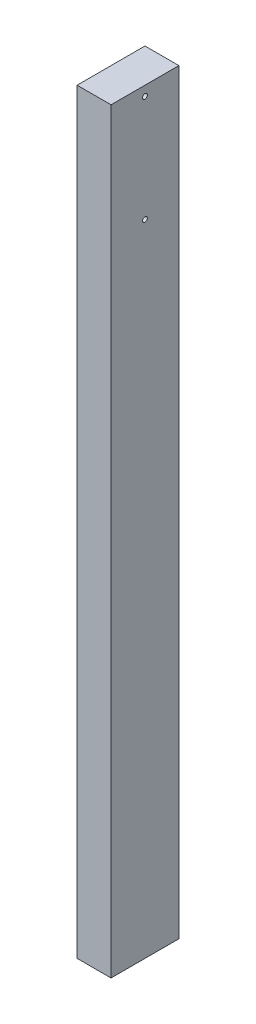
ISO-10303-21;
HEADER;
FILE_DESCRIPTION(('STEP AP214'),'2;1');
FILE_NAME('part.step','',(''),(''),'','','');
FILE_SCHEMA(('AUTOMOTIVE_DESIGN { 1 0 10303 214 1 1 1 1 }'));
ENDSEC;
DATA;
#1=APPLICATION_CONTEXT('core data for automotive mechanical design processes');
#2=APPLICATION_PROTOCOL_DEFINITION('international standard','automotive_design',2000,#1);
#3=PRODUCT_CONTEXT('',#1,'mechanical');
#4=PRODUCT('Part','Part','',(#3));
#5=PRODUCT_RELATED_PRODUCT_CATEGORY('part','',(#4));
#6=PRODUCT_DEFINITION_FORMATION('','',#4);
#7=PRODUCT_DEFINITION_CONTEXT('part definition',#1,'design');
#8=PRODUCT_DEFINITION('design','',#6,#7);
#9=PRODUCT_DEFINITION_SHAPE('','',#8);
#10=(LENGTH_UNIT() NAMED_UNIT(*) SI_UNIT(.MILLI.,.METRE.));
#11=(NAMED_UNIT(*) PLANE_ANGLE_UNIT() SI_UNIT($,.RADIAN.));
#12=(NAMED_UNIT(*) SI_UNIT($,.STERADIAN.) SOLID_ANGLE_UNIT());
#13=UNCERTAINTY_MEASURE_WITH_UNIT(LENGTH_MEASURE(1.E-05),#10,'distance_accuracy_value','');
#14=(GEOMETRIC_REPRESENTATION_CONTEXT(3) GLOBAL_UNCERTAINTY_ASSIGNED_CONTEXT((#13)) GLOBAL_UNIT_ASSIGNED_CONTEXT((#10,
#11,#12)) REPRESENTATION_CONTEXT('',''));
#15=CARTESIAN_POINT('',(0.,0.,0.));
#16=DIRECTION('',(0.,0.,1.));
#17=DIRECTION('',(1.,0.,0.));
#18=AXIS2_PLACEMENT_3D('',#15,#16,#17);
#19=CARTESIAN_POINT('',(-22.225,990.6,-44.45));
#20=DIRECTION('',(1.,0.,0.));
#21=DIRECTION('',(0.,0.,-1.));
#22=AXIS2_PLACEMENT_3D('',#19,#20,#21);
#23=PLANE('',#22);
#24=CARTESIAN_POINT('',(-22.225,838.2,0.));
#25=DIRECTION('',(-1.,0.,0.));
#26=DIRECTION('',(0.,0.,1.));
#27=AXIS2_PLACEMENT_3D('',#24,#25,#26);
#28=CIRCLE('',#27,3.175);
#29=CARTESIAN_POINT('',(-22.225,838.2,3.17500000000001));
#30=VERTEX_POINT('',#29);
#31=EDGE_CURVE('E118',#30,#30,#28,.T.);
#32=ORIENTED_EDGE('',*,*,#31,.F.);
#33=EDGE_LOOP('',(#32));
#34=FACE_BOUND('',#33,.T.);
#35=CARTESIAN_POINT('',(-22.225,977.9,0.));
#36=DIRECTION('',(-1.,0.,0.));
#37=DIRECTION('',(0.,0.,1.));
#38=AXIS2_PLACEMENT_3D('',#35,#36,#37);
#39=CIRCLE('',#38,3.175);
#40=CARTESIAN_POINT('',(-22.225,977.9,3.17500000000001));
#41=VERTEX_POINT('',#40);
#42=EDGE_CURVE('E110',#41,#41,#39,.T.);
#43=ORIENTED_EDGE('',*,*,#42,.F.);
#44=EDGE_LOOP('',(#43));
#45=FACE_BOUND('',#44,.T.);
#46=DIRECTION('',(0.,0.,1.));
#47=VECTOR('',#46,1.);
#48=CARTESIAN_POINT('',(-22.225,0.,-44.45));
#49=LINE('',#48,#47);
#50=CARTESIAN_POINT('',(-22.225,0.,-44.45));
#51=VERTEX_POINT('',#50);
#52=CARTESIAN_POINT('',(-22.225,0.,44.45));
#53=VERTEX_POINT('',#52);
#54=EDGE_CURVE('E101',#51,#53,#49,.T.);
#55=ORIENTED_EDGE('',*,*,#54,.T.);
#56=DIRECTION('',(0.,-1.,0.));
#57=VECTOR('',#56,1.);
#58=CARTESIAN_POINT('',(-22.225,990.6,44.45));
#59=LINE('',#58,#57);
#60=CARTESIAN_POINT('',(-22.225,990.6,44.45));
#61=VERTEX_POINT('',#60);
#62=EDGE_CURVE('E11',#61,#53,#59,.T.);
#63=ORIENTED_EDGE('',*,*,#62,.F.);
#64=DIRECTION('',(0.,0.,1.));
#65=VECTOR('',#64,1.);
#66=CARTESIAN_POINT('',(-22.225,990.6,-44.45));
#67=LINE('',#66,#65);
#68=CARTESIAN_POINT('',(-22.225,990.6,-44.45));
#69=VERTEX_POINT('',#68);
#70=EDGE_CURVE('E88',#69,#61,#67,.T.);
#71=ORIENTED_EDGE('',*,*,#70,.F.);
#72=DIRECTION('',(0.,-1.,0.));
#73=VECTOR('',#72,1.);
#74=CARTESIAN_POINT('',(-22.225,990.6,-44.45));
#75=LINE('',#74,#73);
#76=EDGE_CURVE('E97',#69,#51,#75,.T.);
#77=ORIENTED_EDGE('',*,*,#76,.T.);
#78=EDGE_LOOP('',(#55,#63,#71,#77));
#79=FACE_BOUND('',#78,.T.);
#80=ADVANCED_FACE('F35',(#34,#45,#79),#23,.F.);
#81=CARTESIAN_POINT('',(22.225,990.6,44.45));
#82=DIRECTION('',(0.,0.,-1.));
#83=DIRECTION('',(-1.,0.,0.));
#84=AXIS2_PLACEMENT_3D('',#81,#82,#83);
#85=PLANE('',#84);
#86=DIRECTION('',(1.,0.,0.));
#87=VECTOR('',#86,1.);
#88=CARTESIAN_POINT('',(22.225,0.,44.45));
#89=LINE('',#88,#87);
#90=CARTESIAN_POINT('',(22.225,0.,44.45));
#91=VERTEX_POINT('',#90);
#92=EDGE_CURVE('E92',#53,#91,#89,.T.);
#93=ORIENTED_EDGE('',*,*,#92,.T.);
#94=DIRECTION('',(0.,-1.,0.));
#95=VECTOR('',#94,1.);
#96=CARTESIAN_POINT('',(22.225,990.6,44.45));
#97=LINE('',#96,#95);
#98=CARTESIAN_POINT('',(22.225,990.6,44.45));
#99=VERTEX_POINT('',#98);
#100=EDGE_CURVE('E44',#99,#91,#97,.T.);
#101=ORIENTED_EDGE('',*,*,#100,.F.);
#102=DIRECTION('',(1.,0.,0.));
#103=VECTOR('',#102,1.);
#104=CARTESIAN_POINT('',(22.225,990.6,44.45));
#105=LINE('',#104,#103);
#106=EDGE_CURVE('E83',#61,#99,#105,.T.);
#107=ORIENTED_EDGE('',*,*,#106,.F.);
#108=ORIENTED_EDGE('',*,*,#62,.T.);
#109=EDGE_LOOP('',(#93,#101,#107,#108));
#110=FACE_BOUND('',#109,.T.);
#111=ADVANCED_FACE('F91',(#110),#85,.F.);
#112=CARTESIAN_POINT('',(22.225,990.6,-44.45));
#113=DIRECTION('',(-1.,0.,0.));
#114=DIRECTION('',(0.,0.,1.));
#115=AXIS2_PLACEMENT_3D('',#112,#113,#114);
#116=PLANE('',#115);
#117=CARTESIAN_POINT('',(22.2250000000001,838.2,0.));
#118=DIRECTION('',(-1.,0.,0.));
#119=DIRECTION('',(0.,0.,1.));
#120=AXIS2_PLACEMENT_3D('',#117,#118,#119);
#121=CIRCLE('',#120,3.175);
#122=CARTESIAN_POINT('',(22.2250000000001,838.2,3.175));
#123=VERTEX_POINT('',#122);
#124=EDGE_CURVE('E38',#123,#123,#121,.T.);
#125=ORIENTED_EDGE('',*,*,#124,.T.);
#126=EDGE_LOOP('',(#125));
#127=FACE_BOUND('',#126,.T.);
#128=CARTESIAN_POINT('',(22.2250000000001,977.9,0.));
#129=DIRECTION('',(-1.,0.,0.));
#130=DIRECTION('',(0.,0.,1.));
#131=AXIS2_PLACEMENT_3D('',#128,#129,#130);
#132=CIRCLE('',#131,3.175);
#133=CARTESIAN_POINT('',(22.2250000000001,977.9,3.175));
#134=VERTEX_POINT('',#133);
#135=EDGE_CURVE('E104',#134,#134,#132,.T.);
#136=ORIENTED_EDGE('',*,*,#135,.T.);
#137=EDGE_LOOP('',(#136));
#138=FACE_BOUND('',#137,.T.);
#139=DIRECTION('',(0.,0.,-1.));
#140=VECTOR('',#139,1.);
#141=CARTESIAN_POINT('',(22.225,0.,-44.45));
#142=LINE('',#141,#140);
#143=CARTESIAN_POINT('',(22.225,0.,-44.45));
#144=VERTEX_POINT('',#143);
#145=EDGE_CURVE('E70',#91,#144,#142,.T.);
#146=ORIENTED_EDGE('',*,*,#145,.T.);
#147=DIRECTION('',(0.,-1.,0.));
#148=VECTOR('',#147,1.);
#149=CARTESIAN_POINT('',(22.225,990.6,-44.45));
#150=LINE('',#149,#148);
#151=CARTESIAN_POINT('',(22.225,990.6,-44.45));
#152=VERTEX_POINT('',#151);
#153=EDGE_CURVE('E93',#152,#144,#150,.T.);
#154=ORIENTED_EDGE('',*,*,#153,.F.);
#155=DIRECTION('',(0.,0.,-1.));
#156=VECTOR('',#155,1.);
#157=CARTESIAN_POINT('',(22.225,990.6,-44.45));
#158=LINE('',#157,#156);
#159=EDGE_CURVE('E86',#99,#152,#158,.T.);
#160=ORIENTED_EDGE('',*,*,#159,.F.);
#161=ORIENTED_EDGE('',*,*,#100,.T.);
#162=EDGE_LOOP('',(#146,#154,#160,#161));
#163=FACE_BOUND('',#162,.T.);
#164=ADVANCED_FACE('F95',(#127,#138,#163),#116,.F.);
#165=CARTESIAN_POINT('',(22.225,990.6,-44.45));
#166=DIRECTION('',(0.,0.,1.));
#167=DIRECTION('',(1.,0.,0.));
#168=AXIS2_PLACEMENT_3D('',#165,#166,#167);
#169=PLANE('',#168);
#170=DIRECTION('',(-1.,0.,0.));
#171=VECTOR('',#170,1.);
#172=CARTESIAN_POINT('',(22.225,0.,-44.45));
#173=LINE('',#172,#171);
#174=EDGE_CURVE('E76',#144,#51,#173,.T.);
#175=ORIENTED_EDGE('',*,*,#174,.T.);
#176=ORIENTED_EDGE('',*,*,#76,.F.);
#177=DIRECTION('',(-1.,0.,0.));
#178=VECTOR('',#177,1.);
#179=CARTESIAN_POINT('',(22.225,990.6,-44.45));
#180=LINE('',#179,#178);
#181=EDGE_CURVE('E53',#152,#69,#180,.T.);
#182=ORIENTED_EDGE('',*,*,#181,.F.);
#183=ORIENTED_EDGE('',*,*,#153,.T.);
#184=EDGE_LOOP('',(#175,#176,#182,#183));
#185=FACE_BOUND('',#184,.T.);
#186=ADVANCED_FACE('F140',(#185),#169,.F.);
#187=CARTESIAN_POINT('',(0.,990.6,0.));
#188=DIRECTION('',(0.,-1.,0.));
#189=DIRECTION('',(0.,0.,-1.));
#190=AXIS2_PLACEMENT_3D('',#187,#188,#189);
#191=PLANE('',#190);
#192=ORIENTED_EDGE('',*,*,#70,.T.);
#193=ORIENTED_EDGE('',*,*,#106,.T.);
#194=ORIENTED_EDGE('',*,*,#159,.T.);
#195=ORIENTED_EDGE('',*,*,#181,.T.);
#196=EDGE_LOOP('',(#192,#193,#194,#195));
#197=FACE_BOUND('',#196,.T.);
#198=ADVANCED_FACE('F84',(#197),#191,.F.);
#199=CARTESIAN_POINT('',(0.,0.,0.));
#200=DIRECTION('',(0.,-1.,0.));
#201=DIRECTION('',(0.,0.,-1.));
#202=AXIS2_PLACEMENT_3D('',#199,#200,#201);
#203=PLANE('',#202);
#204=ORIENTED_EDGE('',*,*,#54,.F.);
#205=ORIENTED_EDGE('',*,*,#174,.F.);
#206=ORIENTED_EDGE('',*,*,#145,.F.);
#207=ORIENTED_EDGE('',*,*,#92,.F.);
#208=EDGE_LOOP('',(#204,#205,#206,#207));
#209=FACE_BOUND('',#208,.T.);
#210=ADVANCED_FACE('F131',(#209),#203,.T.);
#211=CARTESIAN_POINT('',(955.675,977.9,0.));
#212=DIRECTION('',(-1.,0.,0.));
#213=DIRECTION('',(0.,0.,1.));
#214=AXIS2_PLACEMENT_3D('',#211,#212,#213);
#215=CYLINDRICAL_SURFACE('',#214,3.175);
#216=ORIENTED_EDGE('',*,*,#42,.T.);
#217=EDGE_LOOP('',(#216));
#218=FACE_BOUND('',#217,.T.);
#219=ORIENTED_EDGE('',*,*,#135,.F.);
#220=EDGE_LOOP('',(#219));
#221=FACE_BOUND('',#220,.T.);
#222=ADVANCED_FACE('F133',(#218,#221),#215,.F.);
#223=CARTESIAN_POINT('',(955.675,838.2,0.));
#224=DIRECTION('',(-1.,0.,0.));
#225=DIRECTION('',(0.,0.,1.));
#226=AXIS2_PLACEMENT_3D('',#223,#224,#225);
#227=CYLINDRICAL_SURFACE('',#226,3.175);
#228=ORIENTED_EDGE('',*,*,#31,.T.);
#229=EDGE_LOOP('',(#228));
#230=FACE_BOUND('',#229,.T.);
#231=ORIENTED_EDGE('',*,*,#124,.F.);
#232=EDGE_LOOP('',(#231));
#233=FACE_BOUND('',#232,.T.);
#234=ADVANCED_FACE('F123',(#230,#233),#227,.F.);
#235=CLOSED_SHELL('',(#80,#111,#164,#186,#198,#210,#222,#234));
#236=MANIFOLD_SOLID_BREP('B2',#235);
#237=ADVANCED_BREP_SHAPE_REPRESENTATION('',(#18,#236),#14);
#238=SHAPE_DEFINITION_REPRESENTATION(#9,#237);
ENDSEC;
END-ISO-10303-21;
